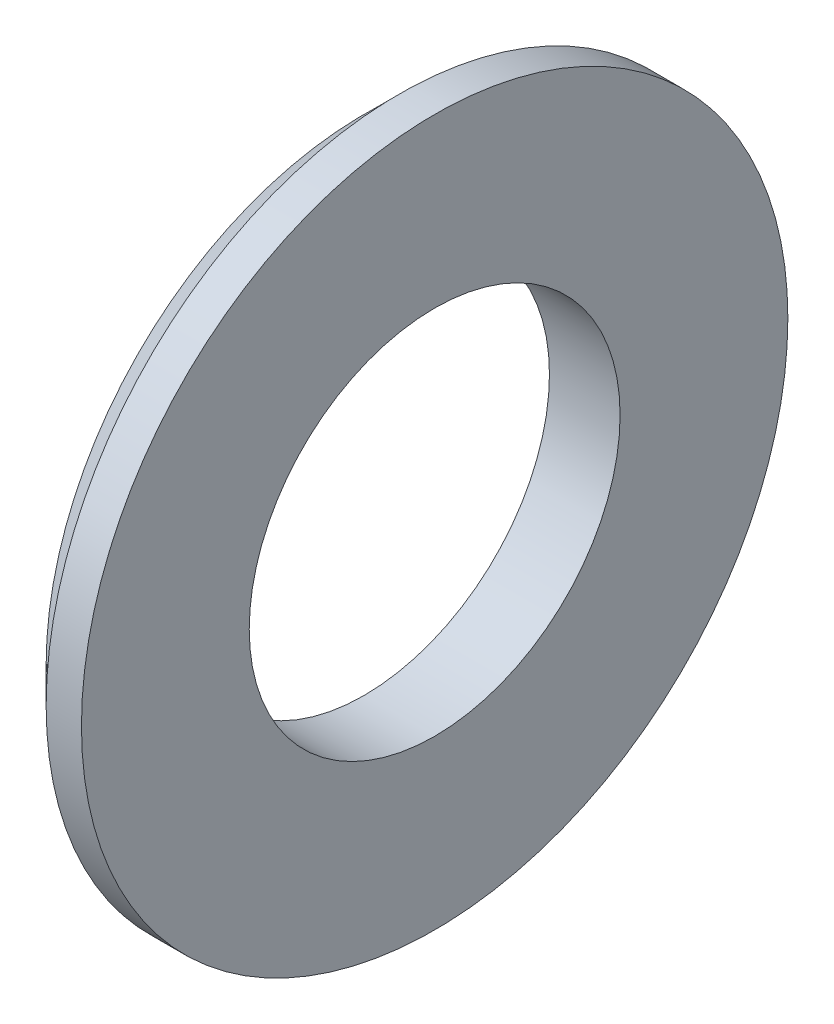
ISO-10303-21;
HEADER;
FILE_DESCRIPTION(('STEP AP214'),'2;1');
FILE_NAME('part.step','',(''),(''),'','','');
FILE_SCHEMA(('AUTOMOTIVE_DESIGN { 1 0 10303 214 1 1 1 1 }'));
ENDSEC;
DATA;
#1=APPLICATION_CONTEXT('core data for automotive mechanical design processes');
#2=APPLICATION_PROTOCOL_DEFINITION('international standard','automotive_design',2000,#1);
#3=PRODUCT_CONTEXT('',#1,'mechanical');
#4=PRODUCT('Part','Part','',(#3));
#5=PRODUCT_RELATED_PRODUCT_CATEGORY('part','',(#4));
#6=PRODUCT_DEFINITION_FORMATION('','',#4);
#7=PRODUCT_DEFINITION_CONTEXT('part definition',#1,'design');
#8=PRODUCT_DEFINITION('design','',#6,#7);
#9=PRODUCT_DEFINITION_SHAPE('','',#8);
#10=(LENGTH_UNIT() NAMED_UNIT(*) SI_UNIT(.MILLI.,.METRE.));
#11=(NAMED_UNIT(*) PLANE_ANGLE_UNIT() SI_UNIT($,.RADIAN.));
#12=(NAMED_UNIT(*) SI_UNIT($,.STERADIAN.) SOLID_ANGLE_UNIT());
#13=UNCERTAINTY_MEASURE_WITH_UNIT(LENGTH_MEASURE(1.E-05),#10,'distance_accuracy_value','');
#14=(GEOMETRIC_REPRESENTATION_CONTEXT(3) GLOBAL_UNCERTAINTY_ASSIGNED_CONTEXT((#13)) GLOBAL_UNIT_ASSIGNED_CONTEXT((#10,
#11,#12)) REPRESENTATION_CONTEXT('',''));
#15=CARTESIAN_POINT('',(0.,0.,0.));
#16=DIRECTION('',(0.,0.,1.));
#17=DIRECTION('',(1.,0.,0.));
#18=AXIS2_PLACEMENT_3D('',#15,#16,#17);
#19=CARTESIAN_POINT('',(-34.9249999999999,0.,0.));
#20=DIRECTION('',(-1.,0.,0.));
#21=DIRECTION('',(0.,0.,1.));
#22=AXIS2_PLACEMENT_3D('',#19,#20,#21);
#23=CYLINDRICAL_SURFACE('',#22,5.25);
#24=CARTESIAN_POINT('',(0.,0.,0.));
#25=DIRECTION('',(-1.,0.,0.));
#26=DIRECTION('',(0.,0.,1.));
#27=AXIS2_PLACEMENT_3D('',#24,#25,#26);
#28=CIRCLE('',#27,5.25);
#29=CARTESIAN_POINT('',(0.,0.,5.25));
#30=VERTEX_POINT('',#29);
#31=EDGE_CURVE('E10',#30,#30,#28,.T.);
#32=ORIENTED_EDGE('',*,*,#31,.F.);
#33=EDGE_LOOP('',(#32));
#34=FACE_BOUND('',#33,.T.);
#35=CARTESIAN_POINT('',(-2.,0.,0.));
#36=DIRECTION('',(-1.,0.,0.));
#37=DIRECTION('',(0.,0.,1.));
#38=AXIS2_PLACEMENT_3D('',#35,#36,#37);
#39=CIRCLE('',#38,5.25);
#40=CARTESIAN_POINT('',(-2.,0.,5.25));
#41=VERTEX_POINT('',#40);
#42=EDGE_CURVE('E49',#41,#41,#39,.T.);
#43=ORIENTED_EDGE('',*,*,#42,.T.);
#44=EDGE_LOOP('',(#43));
#45=FACE_BOUND('',#44,.T.);
#46=ADVANCED_FACE('F30',(#34,#45),#23,.F.);
#47=CARTESIAN_POINT('',(0.,5.25,0.));
#48=DIRECTION('',(-1.,0.,0.));
#49=DIRECTION('',(0.,0.,1.));
#50=AXIS2_PLACEMENT_3D('',#47,#48,#49);
#51=PLANE('',#50);
#52=CARTESIAN_POINT('',(0.,0.,0.));
#53=DIRECTION('',(-1.,0.,0.));
#54=DIRECTION('',(0.,0.,1.));
#55=AXIS2_PLACEMENT_3D('',#52,#53,#54);
#56=CIRCLE('',#55,10.);
#57=CARTESIAN_POINT('',(0.,0.,10.));
#58=VERTEX_POINT('',#57);
#59=EDGE_CURVE('E36',#58,#58,#56,.T.);
#60=ORIENTED_EDGE('',*,*,#59,.F.);
#61=EDGE_LOOP('',(#60));
#62=FACE_BOUND('',#61,.T.);
#63=ORIENTED_EDGE('',*,*,#31,.T.);
#64=EDGE_LOOP('',(#63));
#65=FACE_BOUND('',#64,.T.);
#66=ADVANCED_FACE('F68',(#62,#65),#51,.F.);
#67=CARTESIAN_POINT('',(-34.9249999999999,0.,0.));
#68=DIRECTION('',(-1.,0.,0.));
#69=DIRECTION('',(0.,0.,1.));
#70=AXIS2_PLACEMENT_3D('',#67,#68,#69);
#71=CYLINDRICAL_SURFACE('',#70,10.);
#72=CARTESIAN_POINT('',(-1.,0.,0.));
#73=DIRECTION('',(-1.,0.,0.));
#74=DIRECTION('',(0.,0.,1.));
#75=AXIS2_PLACEMENT_3D('',#72,#73,#74);
#76=CIRCLE('',#75,10.);
#77=CARTESIAN_POINT('',(-1.,0.,10.));
#78=VERTEX_POINT('',#77);
#79=EDGE_CURVE('E40',#78,#78,#76,.T.);
#80=ORIENTED_EDGE('',*,*,#79,.F.);
#81=EDGE_LOOP('',(#80));
#82=FACE_BOUND('',#81,.T.);
#83=ORIENTED_EDGE('',*,*,#59,.T.);
#84=EDGE_LOOP('',(#83));
#85=FACE_BOUND('',#84,.T.);
#86=ADVANCED_FACE('F62',(#82,#85),#71,.T.);
#87=CARTESIAN_POINT('',(-2.,0.,0.));
#88=DIRECTION('',(1.,0.,0.));
#89=DIRECTION('',(0.,0.,-1.));
#90=AXIS2_PLACEMENT_3D('',#87,#88,#89);
#91=CONICAL_SURFACE('',#90,8.99999999999999,0.785398163397453);
#92=ORIENTED_EDGE('',*,*,#79,.T.);
#93=EDGE_LOOP('',(#92));
#94=FACE_BOUND('',#93,.T.);
#95=CARTESIAN_POINT('',(-2.,0.,0.));
#96=DIRECTION('',(-1.,0.,0.));
#97=DIRECTION('',(0.,0.,1.));
#98=AXIS2_PLACEMENT_3D('',#95,#96,#97);
#99=CIRCLE('',#98,8.99999999999999);
#100=CARTESIAN_POINT('',(-2.,0.,8.99999999999999));
#101=VERTEX_POINT('',#100);
#102=EDGE_CURVE('E44',#101,#101,#99,.T.);
#103=ORIENTED_EDGE('',*,*,#102,.F.);
#104=EDGE_LOOP('',(#103));
#105=FACE_BOUND('',#104,.T.);
#106=ADVANCED_FACE('F57',(#94,#105),#91,.T.);
#107=CARTESIAN_POINT('',(-2.,8.99999999999999,0.));
#108=DIRECTION('',(1.,0.,0.));
#109=DIRECTION('',(0.,0.,-1.));
#110=AXIS2_PLACEMENT_3D('',#107,#108,#109);
#111=PLANE('',#110);
#112=ORIENTED_EDGE('',*,*,#42,.F.);
#113=EDGE_LOOP('',(#112));
#114=FACE_BOUND('',#113,.T.);
#115=ORIENTED_EDGE('',*,*,#102,.T.);
#116=EDGE_LOOP('',(#115));
#117=FACE_BOUND('',#116,.T.);
#118=ADVANCED_FACE('F54',(#114,#117),#111,.F.);
#119=CLOSED_SHELL('',(#46,#66,#86,#106,#118));
#120=MANIFOLD_SOLID_BREP('B2',#119);
#121=ADVANCED_BREP_SHAPE_REPRESENTATION('',(#18,#120),#14);
#122=SHAPE_DEFINITION_REPRESENTATION(#9,#121);
ENDSEC;
END-ISO-10303-21;
